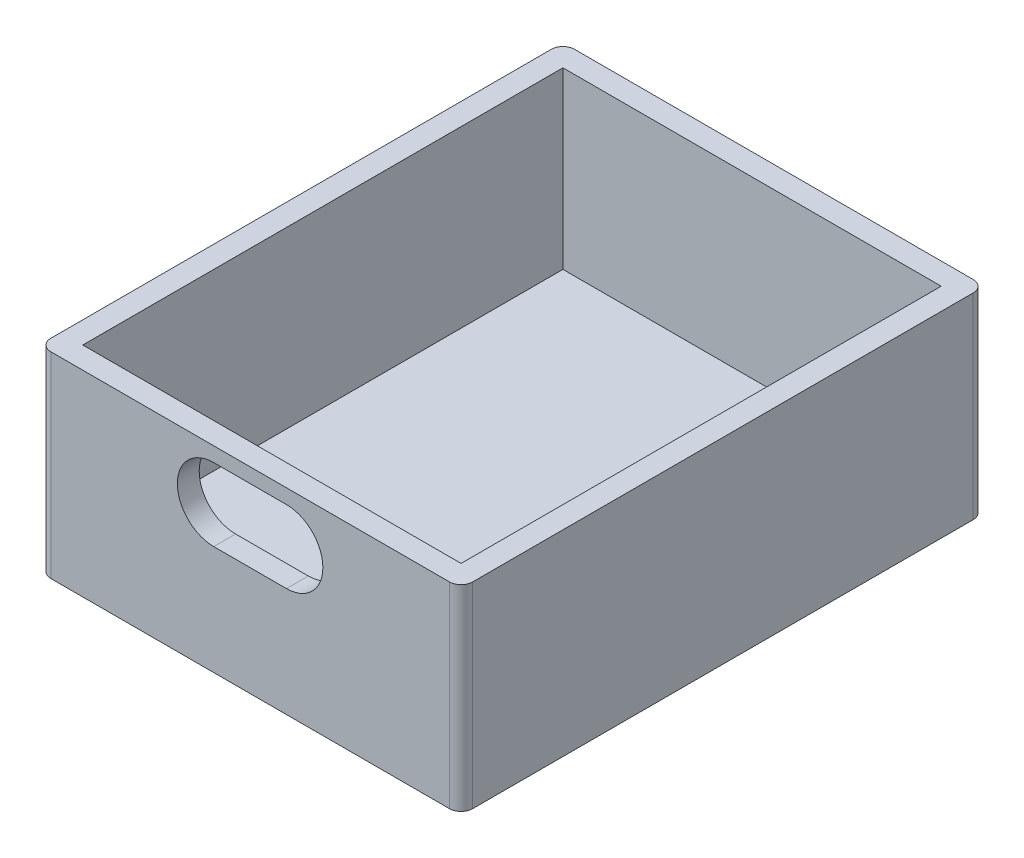
ISO-10303-21;
HEADER;
FILE_DESCRIPTION(('STEP AP214'),'2;1');
FILE_NAME('part.step','',(''),(''),'','','');
FILE_SCHEMA(('AUTOMOTIVE_DESIGN { 1 0 10303 214 1 1 1 1 }'));
ENDSEC;
DATA;
#1=APPLICATION_CONTEXT('core data for automotive mechanical design processes');
#2=APPLICATION_PROTOCOL_DEFINITION('international standard','automotive_design',2000,#1);
#3=PRODUCT_CONTEXT('',#1,'mechanical');
#4=PRODUCT('Part','Part','',(#3));
#5=PRODUCT_RELATED_PRODUCT_CATEGORY('part','',(#4));
#6=PRODUCT_DEFINITION_FORMATION('','',#4);
#7=PRODUCT_DEFINITION_CONTEXT('part definition',#1,'design');
#8=PRODUCT_DEFINITION('design','',#6,#7);
#9=PRODUCT_DEFINITION_SHAPE('','',#8);
#10=(LENGTH_UNIT() NAMED_UNIT(*) SI_UNIT(.MILLI.,.METRE.));
#11=(NAMED_UNIT(*) PLANE_ANGLE_UNIT() SI_UNIT($,.RADIAN.));
#12=(NAMED_UNIT(*) SI_UNIT($,.STERADIAN.) SOLID_ANGLE_UNIT());
#13=UNCERTAINTY_MEASURE_WITH_UNIT(LENGTH_MEASURE(1.E-05),#10,'distance_accuracy_value','');
#14=(GEOMETRIC_REPRESENTATION_CONTEXT(3) GLOBAL_UNCERTAINTY_ASSIGNED_CONTEXT((#13)) GLOBAL_UNIT_ASSIGNED_CONTEXT((#10,
#11,#12)) REPRESENTATION_CONTEXT('',''));
#15=CARTESIAN_POINT('',(0.,0.,0.));
#16=DIRECTION('',(0.,0.,1.));
#17=DIRECTION('',(1.,0.,0.));
#18=AXIS2_PLACEMENT_3D('',#15,#16,#17);
#19=CARTESIAN_POINT('',(0.,-13.5,36.));
#20=DIRECTION('',(0.,1.,0.));
#21=DIRECTION('',(0.,0.,1.));
#22=AXIS2_PLACEMENT_3D('',#19,#20,#21);
#23=PLANE('',#22);
#24=DIRECTION('',(-1.,0.,0.));
#25=VECTOR('',#24,1.);
#26=CARTESIAN_POINT('',(27.2201532544553,-13.5,13.));
#27=LINE('',#26,#25);
#28=CARTESIAN_POINT('',(8.,-13.5,13.));
#29=VERTEX_POINT('',#28);
#30=CARTESIAN_POINT('',(4.,-13.5,13.));
#31=VERTEX_POINT('',#30);
#32=EDGE_CURVE('E752',#29,#31,#27,.T.);
#33=ORIENTED_EDGE('',*,*,#32,.F.);
#34=DIRECTION('',(0.,0.,1.));
#35=VECTOR('',#34,1.);
#36=CARTESIAN_POINT('',(8.,-13.5,10.));
#37=LINE('',#36,#35);
#38=CARTESIAN_POINT('',(8.,-13.5,10.));
#39=VERTEX_POINT('',#38);
#40=EDGE_CURVE('E780',#39,#29,#37,.T.);
#41=ORIENTED_EDGE('',*,*,#40,.F.);
#42=DIRECTION('',(1.,0.,0.));
#43=VECTOR('',#42,1.);
#44=CARTESIAN_POINT('',(8.,-13.5,10.));
#45=LINE('',#44,#43);
#46=CARTESIAN_POINT('',(4.,-13.5,10.));
#47=VERTEX_POINT('',#46);
#48=EDGE_CURVE('E785',#47,#39,#45,.T.);
#49=ORIENTED_EDGE('',*,*,#48,.F.);
#50=DIRECTION('',(0.,0.,-1.));
#51=VECTOR('',#50,1.);
#52=CARTESIAN_POINT('',(4.,-13.5,10.));
#53=LINE('',#52,#51);
#54=EDGE_CURVE('E792',#31,#47,#53,.T.);
#55=ORIENTED_EDGE('',*,*,#54,.F.);
#56=EDGE_LOOP('',(#33,#41,#49,#55));
#57=FACE_BOUND('',#56,.T.);
#58=DIRECTION('',(1.,0.,0.));
#59=VECTOR('',#58,1.);
#60=CARTESIAN_POINT('',(0.,-13.5,36.));
#61=LINE('',#60,#59);
#62=CARTESIAN_POINT('',(0.800000000000003,-13.5,36.));
#63=VERTEX_POINT('',#62);
#64=CARTESIAN_POINT('',(28.2,-13.5,36.));
#65=VERTEX_POINT('',#64);
#66=EDGE_CURVE('E342',#63,#65,#61,.T.);
#67=ORIENTED_EDGE('',*,*,#66,.F.);
#68=CARTESIAN_POINT('',(0.800000000000003,-13.5,35.2));
#69=DIRECTION('',(0.,1.,0.));
#70=DIRECTION('',(0.,0.,1.));
#71=AXIS2_PLACEMENT_3D('',#68,#69,#70);
#72=CIRCLE('',#71,0.8);
#73=CARTESIAN_POINT('',(0.,-13.5,35.2));
#74=VERTEX_POINT('',#73);
#75=EDGE_CURVE('E377',#63,#74,#72,.F.);
#76=ORIENTED_EDGE('',*,*,#75,.T.);
#77=DIRECTION('',(0.,0.,-1.));
#78=VECTOR('',#77,1.);
#79=CARTESIAN_POINT('',(0.,-13.5,36.));
#80=LINE('',#79,#78);
#81=CARTESIAN_POINT('',(0.,-13.5,0.800000000000002));
#82=VERTEX_POINT('',#81);
#83=EDGE_CURVE('E362',#74,#82,#80,.T.);
#84=ORIENTED_EDGE('',*,*,#83,.T.);
#85=CARTESIAN_POINT('',(0.800000000000003,-13.5,0.800000000000002));
#86=DIRECTION('',(0.,1.,0.));
#87=DIRECTION('',(0.,0.,1.));
#88=AXIS2_PLACEMENT_3D('',#85,#86,#87);
#89=CIRCLE('',#88,0.8);
#90=CARTESIAN_POINT('',(0.800000000000003,-13.5,0.));
#91=VERTEX_POINT('',#90);
#92=EDGE_CURVE('E375',#82,#91,#89,.F.);
#93=ORIENTED_EDGE('',*,*,#92,.T.);
#94=DIRECTION('',(1.,0.,0.));
#95=VECTOR('',#94,1.);
#96=CARTESIAN_POINT('',(0.,-13.5,0.));
#97=LINE('',#96,#95);
#98=CARTESIAN_POINT('',(28.2,-13.5,0.));
#99=VERTEX_POINT('',#98);
#100=EDGE_CURVE('E335',#91,#99,#97,.T.);
#101=ORIENTED_EDGE('',*,*,#100,.T.);
#102=CARTESIAN_POINT('',(28.2,-13.5,0.800000000000002));
#103=DIRECTION('',(0.,1.,0.));
#104=DIRECTION('',(0.,0.,1.));
#105=AXIS2_PLACEMENT_3D('',#102,#103,#104);
#106=CIRCLE('',#105,0.8);
#107=CARTESIAN_POINT('',(29.,-13.5,0.800000000000002));
#108=VERTEX_POINT('',#107);
#109=EDGE_CURVE('E373',#99,#108,#106,.F.);
#110=ORIENTED_EDGE('',*,*,#109,.T.);
#111=DIRECTION('',(0.,0.,-1.));
#112=VECTOR('',#111,1.);
#113=CARTESIAN_POINT('',(29.,-13.5,36.));
#114=LINE('',#113,#112);
#115=CARTESIAN_POINT('',(29.,-13.5,35.2));
#116=VERTEX_POINT('',#115);
#117=EDGE_CURVE('E359',#116,#108,#114,.T.);
#118=ORIENTED_EDGE('',*,*,#117,.F.);
#119=CARTESIAN_POINT('',(28.2,-13.5,35.2));
#120=DIRECTION('',(0.,1.,0.));
#121=DIRECTION('',(0.,0.,1.));
#122=AXIS2_PLACEMENT_3D('',#119,#120,#121);
#123=CIRCLE('',#122,0.8);
#124=EDGE_CURVE('E371',#116,#65,#123,.F.);
#125=ORIENTED_EDGE('',*,*,#124,.T.);
#126=EDGE_LOOP('',(#67,#76,#84,#93,#101,#110,#118,#125));
#127=FACE_BOUND('',#126,.T.);
#128=DIRECTION('',(0.,0.,-1.));
#129=VECTOR('',#128,1.);
#130=CARTESIAN_POINT('',(18.,-13.5,10.));
#131=LINE('',#130,#129);
#132=CARTESIAN_POINT('',(18.,-13.5,13.));
#133=VERTEX_POINT('',#132);
#134=CARTESIAN_POINT('',(18.,-13.5,10.));
#135=VERTEX_POINT('',#134);
#136=EDGE_CURVE('E264',#133,#135,#131,.T.);
#137=ORIENTED_EDGE('',*,*,#136,.F.);
#138=CARTESIAN_POINT('',(22.,-13.5,13.));
#139=VERTEX_POINT('',#138);
#140=EDGE_CURVE('E766',#139,#133,#27,.T.);
#141=ORIENTED_EDGE('',*,*,#140,.F.);
#142=DIRECTION('',(0.,0.,1.));
#143=VECTOR('',#142,1.);
#144=CARTESIAN_POINT('',(22.,-13.5,10.));
#145=LINE('',#144,#143);
#146=CARTESIAN_POINT('',(22.,-13.5,10.));
#147=VERTEX_POINT('',#146);
#148=EDGE_CURVE('E244',#147,#139,#145,.T.);
#149=ORIENTED_EDGE('',*,*,#148,.F.);
#150=DIRECTION('',(1.,0.,0.));
#151=VECTOR('',#150,1.);
#152=CARTESIAN_POINT('',(22.,-13.5,10.));
#153=LINE('',#152,#151);
#154=EDGE_CURVE('E255',#135,#147,#153,.T.);
#155=ORIENTED_EDGE('',*,*,#154,.F.);
#156=EDGE_LOOP('',(#137,#141,#149,#155));
#157=FACE_BOUND('',#156,.T.);
#158=ADVANCED_FACE('F35',(#57,#127,#157),#23,.F.);
#159=CARTESIAN_POINT('',(0.,0.,36.));
#160=DIRECTION('',(1.,0.,0.));
#161=DIRECTION('',(0.,1.,0.));
#162=AXIS2_PLACEMENT_3D('',#159,#160,#161);
#163=PLANE('',#162);
#164=ORIENTED_EDGE('',*,*,#83,.F.);
#165=DIRECTION('',(0.,-1.,0.));
#166=VECTOR('',#165,1.);
#167=CARTESIAN_POINT('',(0.,0.,35.2));
#168=LINE('',#167,#166);
#169=CARTESIAN_POINT('',(0.,0.,35.2));
#170=VERTEX_POINT('',#169);
#171=EDGE_CURVE('E382',#74,#170,#168,.F.);
#172=ORIENTED_EDGE('',*,*,#171,.T.);
#173=DIRECTION('',(0.,0.,-1.));
#174=VECTOR('',#173,1.);
#175=CARTESIAN_POINT('',(0.,0.,36.));
#176=LINE('',#175,#174);
#177=CARTESIAN_POINT('',(0.,0.,0.800000000000002));
#178=VERTEX_POINT('',#177);
#179=EDGE_CURVE('E349',#170,#178,#176,.T.);
#180=ORIENTED_EDGE('',*,*,#179,.T.);
#181=DIRECTION('',(0.,-1.,0.));
#182=VECTOR('',#181,1.);
#183=CARTESIAN_POINT('',(0.,0.,0.800000000000002));
#184=LINE('',#183,#182);
#185=EDGE_CURVE('E379',#178,#82,#184,.T.);
#186=ORIENTED_EDGE('',*,*,#185,.T.);
#187=EDGE_LOOP('',(#164,#172,#180,#186));
#188=FACE_BOUND('',#187,.T.);
#189=ADVANCED_FACE('F421',(#188),#163,.F.);
#190=CARTESIAN_POINT('',(29.,0.,36.));
#191=DIRECTION('',(-1.,0.,0.));
#192=DIRECTION('',(0.,-1.,0.));
#193=AXIS2_PLACEMENT_3D('',#190,#191,#192);
#194=PLANE('',#193);
#195=ORIENTED_EDGE('',*,*,#117,.T.);
#196=DIRECTION('',(0.,1.,0.));
#197=VECTOR('',#196,1.);
#198=CARTESIAN_POINT('',(29.,0.,0.800000000000002));
#199=LINE('',#198,#197);
#200=CARTESIAN_POINT('',(29.,0.,0.800000000000002));
#201=VERTEX_POINT('',#200);
#202=EDGE_CURVE('E11',#108,#201,#199,.T.);
#203=ORIENTED_EDGE('',*,*,#202,.T.);
#204=DIRECTION('',(0.,0.,-1.));
#205=VECTOR('',#204,1.);
#206=CARTESIAN_POINT('',(29.,0.,36.));
#207=LINE('',#206,#205);
#208=CARTESIAN_POINT('',(29.,0.,35.2));
#209=VERTEX_POINT('',#208);
#210=EDGE_CURVE('E356',#209,#201,#207,.T.);
#211=ORIENTED_EDGE('',*,*,#210,.F.);
#212=DIRECTION('',(0.,1.,0.));
#213=VECTOR('',#212,1.);
#214=CARTESIAN_POINT('',(29.,-13.5,35.2));
#215=LINE('',#214,#213);
#216=EDGE_CURVE('E43',#209,#116,#215,.F.);
#217=ORIENTED_EDGE('',*,*,#216,.T.);
#218=EDGE_LOOP('',(#195,#203,#211,#217));
#219=FACE_BOUND('',#218,.T.);
#220=ADVANCED_FACE('F399',(#219),#194,.F.);
#221=CARTESIAN_POINT('',(0.,0.,36.));
#222=DIRECTION('',(0.,-1.,0.));
#223=DIRECTION('',(0.,0.,-1.));
#224=AXIS2_PLACEMENT_3D('',#221,#222,#223);
#225=PLANE('',#224);
#226=DIRECTION('',(1.,0.,0.));
#227=VECTOR('',#226,1.);
#228=CARTESIAN_POINT('',(1.5,0.,34.5));
#229=LINE('',#228,#227);
#230=CARTESIAN_POINT('',(1.5,0.,34.5));
#231=VERTEX_POINT('',#230);
#232=CARTESIAN_POINT('',(27.5,0.,34.5));
#233=VERTEX_POINT('',#232);
#234=EDGE_CURVE('E325',#231,#233,#229,.T.);
#235=ORIENTED_EDGE('',*,*,#234,.F.);
#236=DIRECTION('',(0.,0.,1.));
#237=VECTOR('',#236,1.);
#238=CARTESIAN_POINT('',(1.5,0.,1.5));
#239=LINE('',#238,#237);
#240=CARTESIAN_POINT('',(1.5,0.,1.5));
#241=VERTEX_POINT('',#240);
#242=EDGE_CURVE('E309',#241,#231,#239,.T.);
#243=ORIENTED_EDGE('',*,*,#242,.F.);
#244=DIRECTION('',(-1.,0.,0.));
#245=VECTOR('',#244,1.);
#246=CARTESIAN_POINT('',(1.5,0.,1.5));
#247=LINE('',#246,#245);
#248=CARTESIAN_POINT('',(27.5,0.,1.5));
#249=VERTEX_POINT('',#248);
#250=EDGE_CURVE('E314',#249,#241,#247,.T.);
#251=ORIENTED_EDGE('',*,*,#250,.F.);
#252=DIRECTION('',(0.,0.,-1.));
#253=VECTOR('',#252,1.);
#254=CARTESIAN_POINT('',(27.5,0.,1.5));
#255=LINE('',#254,#253);
#256=EDGE_CURVE('E328',#233,#249,#255,.T.);
#257=ORIENTED_EDGE('',*,*,#256,.F.);
#258=EDGE_LOOP('',(#235,#243,#251,#257));
#259=FACE_BOUND('',#258,.T.);
#260=ORIENTED_EDGE('',*,*,#179,.F.);
#261=CARTESIAN_POINT('',(0.8,0.,35.2));
#262=DIRECTION('',(0.,-1.,0.));
#263=DIRECTION('',(0.,0.,-1.));
#264=AXIS2_PLACEMENT_3D('',#261,#262,#263);
#265=CIRCLE('',#264,0.8);
#266=CARTESIAN_POINT('',(0.8,0.,36.));
#267=VERTEX_POINT('',#266);
#268=EDGE_CURVE('E390',#170,#267,#265,.F.);
#269=ORIENTED_EDGE('',*,*,#268,.T.);
#270=DIRECTION('',(-1.,0.,0.));
#271=VECTOR('',#270,1.);
#272=CARTESIAN_POINT('',(0.,0.,36.));
#273=LINE('',#272,#271);
#274=CARTESIAN_POINT('',(28.2,0.,36.));
#275=VERTEX_POINT('',#274);
#276=EDGE_CURVE('E345',#275,#267,#273,.T.);
#277=ORIENTED_EDGE('',*,*,#276,.F.);
#278=CARTESIAN_POINT('',(28.2,0.,35.2));
#279=DIRECTION('',(0.,-1.,0.));
#280=DIRECTION('',(0.,0.,-1.));
#281=AXIS2_PLACEMENT_3D('',#278,#279,#280);
#282=CIRCLE('',#281,0.8);
#283=EDGE_CURVE('E384',#275,#209,#282,.F.);
#284=ORIENTED_EDGE('',*,*,#283,.T.);
#285=ORIENTED_EDGE('',*,*,#210,.T.);
#286=CARTESIAN_POINT('',(28.2,0.,0.800000000000002));
#287=DIRECTION('',(0.,-1.,0.));
#288=DIRECTION('',(0.,0.,-1.));
#289=AXIS2_PLACEMENT_3D('',#286,#287,#288);
#290=CIRCLE('',#289,0.8);
#291=CARTESIAN_POINT('',(28.2,0.,0.));
#292=VERTEX_POINT('',#291);
#293=EDGE_CURVE('E386',#201,#292,#290,.F.);
#294=ORIENTED_EDGE('',*,*,#293,.T.);
#295=DIRECTION('',(-1.,0.,0.));
#296=VECTOR('',#295,1.);
#297=CARTESIAN_POINT('',(0.,0.,0.));
#298=LINE('',#297,#296);
#299=CARTESIAN_POINT('',(0.8,0.,0.));
#300=VERTEX_POINT('',#299);
#301=EDGE_CURVE('E346',#292,#300,#298,.T.);
#302=ORIENTED_EDGE('',*,*,#301,.T.);
#303=CARTESIAN_POINT('',(0.8,0.,0.800000000000002));
#304=DIRECTION('',(0.,-1.,0.));
#305=DIRECTION('',(0.,0.,-1.));
#306=AXIS2_PLACEMENT_3D('',#303,#304,#305);
#307=CIRCLE('',#306,0.8);
#308=EDGE_CURVE('E388',#300,#178,#307,.F.);
#309=ORIENTED_EDGE('',*,*,#308,.T.);
#310=EDGE_LOOP('',(#260,#269,#277,#284,#285,#294,#302,#309));
#311=FACE_BOUND('',#310,.T.);
#312=ADVANCED_FACE('F414',(#259,#311),#225,.F.);
#313=CARTESIAN_POINT('',(0.,0.,36.));
#314=DIRECTION('',(0.,0.,1.));
#315=DIRECTION('',(1.,0.,0.));
#316=AXIS2_PLACEMENT_3D('',#313,#314,#315);
#317=PLANE('',#316);
#318=DIRECTION('',(1.,0.,0.));
#319=VECTOR('',#318,1.);
#320=CARTESIAN_POINT('',(12.,-6.,36.));
#321=LINE('',#320,#319);
#322=CARTESIAN_POINT('',(12.,-6.,36.));
#323=VERTEX_POINT('',#322);
#324=CARTESIAN_POINT('',(17.,-6.,36.));
#325=VERTEX_POINT('',#324);
#326=EDGE_CURVE('E279',#323,#325,#321,.T.);
#327=ORIENTED_EDGE('',*,*,#326,.F.);
#328=CARTESIAN_POINT('',(12.,-3.5,36.));
#329=DIRECTION('',(0.,0.,-1.));
#330=DIRECTION('',(-1.,0.,0.));
#331=AXIS2_PLACEMENT_3D('',#328,#329,#330);
#332=CIRCLE('',#331,2.5);
#333=CARTESIAN_POINT('',(12.,-1.,36.));
#334=VERTEX_POINT('',#333);
#335=EDGE_CURVE('E297',#323,#334,#332,.T.);
#336=ORIENTED_EDGE('',*,*,#335,.T.);
#337=DIRECTION('',(1.,0.,0.));
#338=VECTOR('',#337,1.);
#339=CARTESIAN_POINT('',(12.,-1.,36.));
#340=LINE('',#339,#338);
#341=CARTESIAN_POINT('',(17.,-1.,36.));
#342=VERTEX_POINT('',#341);
#343=EDGE_CURVE('E294',#334,#342,#340,.T.);
#344=ORIENTED_EDGE('',*,*,#343,.T.);
#345=CARTESIAN_POINT('',(17.,-3.5,36.));
#346=DIRECTION('',(0.,0.,1.));
#347=DIRECTION('',(1.,0.,0.));
#348=AXIS2_PLACEMENT_3D('',#345,#346,#347);
#349=CIRCLE('',#348,2.5);
#350=EDGE_CURVE('E291',#325,#342,#349,.T.);
#351=ORIENTED_EDGE('',*,*,#350,.F.);
#352=EDGE_LOOP('',(#327,#336,#344,#351));
#353=FACE_BOUND('',#352,.T.);
#354=ORIENTED_EDGE('',*,*,#276,.T.);
#355=DIRECTION('',(0.,-1.,0.));
#356=VECTOR('',#355,1.);
#357=CARTESIAN_POINT('',(0.800000000000003,-13.5,36.));
#358=LINE('',#357,#356);
#359=EDGE_CURVE('E368',#267,#63,#358,.T.);
#360=ORIENTED_EDGE('',*,*,#359,.T.);
#361=ORIENTED_EDGE('',*,*,#66,.T.);
#362=DIRECTION('',(0.,1.,0.));
#363=VECTOR('',#362,1.);
#364=CARTESIAN_POINT('',(28.2,0.,36.));
#365=LINE('',#364,#363);
#366=EDGE_CURVE('E365',#65,#275,#365,.T.);
#367=ORIENTED_EDGE('',*,*,#366,.T.);
#368=EDGE_LOOP('',(#354,#360,#361,#367));
#369=FACE_BOUND('',#368,.T.);
#370=ADVANCED_FACE('F410',(#353,#369),#317,.T.);
#371=CARTESIAN_POINT('',(0.,0.,0.));
#372=DIRECTION('',(0.,0.,1.));
#373=DIRECTION('',(1.,0.,0.));
#374=AXIS2_PLACEMENT_3D('',#371,#372,#373);
#375=PLANE('',#374);
#376=ORIENTED_EDGE('',*,*,#100,.F.);
#377=DIRECTION('',(0.,-1.,0.));
#378=VECTOR('',#377,1.);
#379=CARTESIAN_POINT('',(0.8,0.,0.));
#380=LINE('',#379,#378);
#381=EDGE_CURVE('E394',#91,#300,#380,.F.);
#382=ORIENTED_EDGE('',*,*,#381,.T.);
#383=ORIENTED_EDGE('',*,*,#301,.F.);
#384=DIRECTION('',(0.,1.,0.));
#385=VECTOR('',#384,1.);
#386=CARTESIAN_POINT('',(28.2,0.,0.));
#387=LINE('',#386,#385);
#388=EDGE_CURVE('E392',#292,#99,#387,.F.);
#389=ORIENTED_EDGE('',*,*,#388,.T.);
#390=EDGE_LOOP('',(#376,#382,#383,#389));
#391=FACE_BOUND('',#390,.T.);
#392=ADVANCED_FACE('F429',(#391),#375,.F.);
#393=CARTESIAN_POINT('',(1.5,-12.,1.5));
#394=DIRECTION('',(-1.,0.,0.));
#395=DIRECTION('',(0.,0.,1.));
#396=AXIS2_PLACEMENT_3D('',#393,#394,#395);
#397=PLANE('',#396);
#398=ORIENTED_EDGE('',*,*,#242,.T.);
#399=DIRECTION('',(0.,1.,0.));
#400=VECTOR('',#399,1.);
#401=CARTESIAN_POINT('',(1.5,-12.,34.5));
#402=LINE('',#401,#400);
#403=CARTESIAN_POINT('',(1.5,-12.,34.5));
#404=VERTEX_POINT('',#403);
#405=EDGE_CURVE('E323',#404,#231,#402,.T.);
#406=ORIENTED_EDGE('',*,*,#405,.F.);
#407=DIRECTION('',(0.,0.,1.));
#408=VECTOR('',#407,1.);
#409=CARTESIAN_POINT('',(1.5,-12.,1.5));
#410=LINE('',#409,#408);
#411=CARTESIAN_POINT('',(1.5,-12.,1.5));
#412=VERTEX_POINT('',#411);
#413=EDGE_CURVE('E310',#412,#404,#410,.T.);
#414=ORIENTED_EDGE('',*,*,#413,.F.);
#415=DIRECTION('',(0.,1.,0.));
#416=VECTOR('',#415,1.);
#417=CARTESIAN_POINT('',(1.5,-12.,1.5));
#418=LINE('',#417,#416);
#419=EDGE_CURVE('E333',#412,#241,#418,.T.);
#420=ORIENTED_EDGE('',*,*,#419,.T.);
#421=EDGE_LOOP('',(#398,#406,#414,#420));
#422=FACE_BOUND('',#421,.T.);
#423=ADVANCED_FACE('F481',(#422),#397,.F.);
#424=CARTESIAN_POINT('',(1.5,-12.,1.5));
#425=DIRECTION('',(0.,0.,-1.));
#426=DIRECTION('',(-1.,0.,0.));
#427=AXIS2_PLACEMENT_3D('',#424,#425,#426);
#428=PLANE('',#427);
#429=ORIENTED_EDGE('',*,*,#250,.T.);
#430=ORIENTED_EDGE('',*,*,#419,.F.);
#431=DIRECTION('',(-1.,0.,0.));
#432=VECTOR('',#431,1.);
#433=CARTESIAN_POINT('',(1.5,-12.,1.5));
#434=LINE('',#433,#432);
#435=CARTESIAN_POINT('',(27.5,-12.,1.5));
#436=VERTEX_POINT('',#435);
#437=EDGE_CURVE('E320',#436,#412,#434,.T.);
#438=ORIENTED_EDGE('',*,*,#437,.F.);
#439=DIRECTION('',(0.,1.,0.));
#440=VECTOR('',#439,1.);
#441=CARTESIAN_POINT('',(27.5,-12.,1.5));
#442=LINE('',#441,#440);
#443=EDGE_CURVE('E336',#436,#249,#442,.T.);
#444=ORIENTED_EDGE('',*,*,#443,.T.);
#445=EDGE_LOOP('',(#429,#430,#438,#444));
#446=FACE_BOUND('',#445,.T.);
#447=ADVANCED_FACE('F477',(#446),#428,.F.);
#448=CARTESIAN_POINT('',(27.5,-12.,1.5));
#449=DIRECTION('',(1.,0.,0.));
#450=DIRECTION('',(0.,0.,-1.));
#451=AXIS2_PLACEMENT_3D('',#448,#449,#450);
#452=PLANE('',#451);
#453=ORIENTED_EDGE('',*,*,#256,.T.);
#454=ORIENTED_EDGE('',*,*,#443,.F.);
#455=DIRECTION('',(0.,0.,-1.));
#456=VECTOR('',#455,1.);
#457=CARTESIAN_POINT('',(27.5,-12.,1.5));
#458=LINE('',#457,#456);
#459=CARTESIAN_POINT('',(27.5,-12.,34.5));
#460=VERTEX_POINT('',#459);
#461=EDGE_CURVE('E317',#460,#436,#458,.T.);
#462=ORIENTED_EDGE('',*,*,#461,.F.);
#463=DIRECTION('',(0.,1.,0.));
#464=VECTOR('',#463,1.);
#465=CARTESIAN_POINT('',(27.5,-12.,34.5));
#466=LINE('',#465,#464);
#467=EDGE_CURVE('E338',#460,#233,#466,.T.);
#468=ORIENTED_EDGE('',*,*,#467,.T.);
#469=EDGE_LOOP('',(#453,#454,#462,#468));
#470=FACE_BOUND('',#469,.T.);
#471=ADVANCED_FACE('F480',(#470),#452,.F.);
#472=CARTESIAN_POINT('',(1.5,-12.,34.5));
#473=DIRECTION('',(0.,0.,1.));
#474=DIRECTION('',(1.,0.,0.));
#475=AXIS2_PLACEMENT_3D('',#472,#473,#474);
#476=PLANE('',#475);
#477=CARTESIAN_POINT('',(12.,-3.5,34.5));
#478=DIRECTION('',(0.,0.,1.));
#479=DIRECTION('',(1.,0.,0.));
#480=AXIS2_PLACEMENT_3D('',#477,#478,#479);
#481=CIRCLE('',#480,2.5);
#482=CARTESIAN_POINT('',(12.,-1.,34.5));
#483=VERTEX_POINT('',#482);
#484=CARTESIAN_POINT('',(12.,-6.,34.5));
#485=VERTEX_POINT('',#484);
#486=EDGE_CURVE('E283',#483,#485,#481,.T.);
#487=ORIENTED_EDGE('',*,*,#486,.T.);
#488=DIRECTION('',(-1.,0.,0.));
#489=VECTOR('',#488,1.);
#490=CARTESIAN_POINT('',(12.,-6.,34.5));
#491=LINE('',#490,#489);
#492=CARTESIAN_POINT('',(17.,-6.,34.5));
#493=VERTEX_POINT('',#492);
#494=EDGE_CURVE('E287',#493,#485,#491,.T.);
#495=ORIENTED_EDGE('',*,*,#494,.F.);
#496=CARTESIAN_POINT('',(17.,-3.5,34.5));
#497=DIRECTION('',(0.,0.,1.));
#498=DIRECTION('',(1.,0.,0.));
#499=AXIS2_PLACEMENT_3D('',#496,#497,#498);
#500=CIRCLE('',#499,2.5);
#501=CARTESIAN_POINT('',(17.,-1.,34.5));
#502=VERTEX_POINT('',#501);
#503=EDGE_CURVE('E289',#502,#493,#500,.F.);
#504=ORIENTED_EDGE('',*,*,#503,.F.);
#505=DIRECTION('',(-1.,0.,0.));
#506=VECTOR('',#505,1.);
#507=CARTESIAN_POINT('',(12.,-1.,34.5));
#508=LINE('',#507,#506);
#509=EDGE_CURVE('E280',#502,#483,#508,.T.);
#510=ORIENTED_EDGE('',*,*,#509,.T.);
#511=EDGE_LOOP('',(#487,#495,#504,#510));
#512=FACE_BOUND('',#511,.T.);
#513=ORIENTED_EDGE('',*,*,#234,.T.);
#514=ORIENTED_EDGE('',*,*,#467,.F.);
#515=DIRECTION('',(1.,0.,0.));
#516=VECTOR('',#515,1.);
#517=CARTESIAN_POINT('',(1.5,-12.,34.5));
#518=LINE('',#517,#516);
#519=EDGE_CURVE('E313',#404,#460,#518,.T.);
#520=ORIENTED_EDGE('',*,*,#519,.F.);
#521=ORIENTED_EDGE('',*,*,#405,.T.);
#522=EDGE_LOOP('',(#513,#514,#520,#521));
#523=FACE_BOUND('',#522,.T.);
#524=ADVANCED_FACE('F475',(#512,#523),#476,.F.);
#525=CARTESIAN_POINT('',(0.,-12.,0.));
#526=DIRECTION('',(0.,1.,0.));
#527=DIRECTION('',(0.,0.,1.));
#528=AXIS2_PLACEMENT_3D('',#525,#526,#527);
#529=PLANE('',#528);
#530=ORIENTED_EDGE('',*,*,#413,.T.);
#531=ORIENTED_EDGE('',*,*,#519,.T.);
#532=ORIENTED_EDGE('',*,*,#461,.T.);
#533=ORIENTED_EDGE('',*,*,#437,.T.);
#534=EDGE_LOOP('',(#530,#531,#532,#533));
#535=FACE_BOUND('',#534,.T.);
#536=ADVANCED_FACE('F471',(#535),#529,.T.);
#537=CARTESIAN_POINT('',(12.,-6.,23.319660112501));
#538=DIRECTION('',(0.,-1.,0.));
#539=DIRECTION('',(0.,0.,-1.));
#540=AXIS2_PLACEMENT_3D('',#537,#538,#539);
#541=PLANE('',#540);
#542=ORIENTED_EDGE('',*,*,#494,.T.);
#543=DIRECTION('',(0.,0.,1.));
#544=VECTOR('',#543,1.);
#545=CARTESIAN_POINT('',(12.,-6.,23.319660112501));
#546=LINE('',#545,#544);
#547=EDGE_CURVE('E284',#485,#323,#546,.T.);
#548=ORIENTED_EDGE('',*,*,#547,.T.);
#549=ORIENTED_EDGE('',*,*,#326,.T.);
#550=DIRECTION('',(0.,0.,1.));
#551=VECTOR('',#550,1.);
#552=CARTESIAN_POINT('',(17.,-6.,23.319660112501));
#553=LINE('',#552,#551);
#554=EDGE_CURVE('E300',#493,#325,#553,.T.);
#555=ORIENTED_EDGE('',*,*,#554,.F.);
#556=EDGE_LOOP('',(#542,#548,#549,#555));
#557=FACE_BOUND('',#556,.T.);
#558=ADVANCED_FACE('F468',(#557),#541,.F.);
#559=CARTESIAN_POINT('',(12.,-3.5,23.319660112501));
#560=DIRECTION('',(0.,0.,1.));
#561=DIRECTION('',(1.,0.,0.));
#562=AXIS2_PLACEMENT_3D('',#559,#560,#561);
#563=CYLINDRICAL_SURFACE('',#562,2.5);
#564=DIRECTION('',(0.,0.,1.));
#565=VECTOR('',#564,1.);
#566=CARTESIAN_POINT('',(12.,-1.,23.319660112501));
#567=LINE('',#566,#565);
#568=EDGE_CURVE('E302',#483,#334,#567,.T.);
#569=ORIENTED_EDGE('',*,*,#568,.T.);
#570=ORIENTED_EDGE('',*,*,#335,.F.);
#571=ORIENTED_EDGE('',*,*,#547,.F.);
#572=ORIENTED_EDGE('',*,*,#486,.F.);
#573=EDGE_LOOP('',(#569,#570,#571,#572));
#574=FACE_BOUND('',#573,.T.);
#575=ADVANCED_FACE('F463',(#574),#563,.F.);
#576=CARTESIAN_POINT('',(12.,-1.,23.319660112501));
#577=DIRECTION('',(0.,-1.,0.));
#578=DIRECTION('',(0.,0.,-1.));
#579=AXIS2_PLACEMENT_3D('',#576,#577,#578);
#580=PLANE('',#579);
#581=DIRECTION('',(0.,0.,1.));
#582=VECTOR('',#581,1.);
#583=CARTESIAN_POINT('',(17.,-1.,23.319660112501));
#584=LINE('',#583,#582);
#585=EDGE_CURVE('E304',#502,#342,#584,.T.);
#586=ORIENTED_EDGE('',*,*,#585,.T.);
#587=ORIENTED_EDGE('',*,*,#343,.F.);
#588=ORIENTED_EDGE('',*,*,#568,.F.);
#589=ORIENTED_EDGE('',*,*,#509,.F.);
#590=EDGE_LOOP('',(#586,#587,#588,#589));
#591=FACE_BOUND('',#590,.T.);
#592=ADVANCED_FACE('F457',(#591),#580,.T.);
#593=CARTESIAN_POINT('',(17.,-3.5,23.319660112501));
#594=DIRECTION('',(0.,0.,1.));
#595=DIRECTION('',(1.,0.,0.));
#596=AXIS2_PLACEMENT_3D('',#593,#594,#595);
#597=CYLINDRICAL_SURFACE('',#596,2.5);
#598=ORIENTED_EDGE('',*,*,#503,.T.);
#599=ORIENTED_EDGE('',*,*,#554,.T.);
#600=ORIENTED_EDGE('',*,*,#350,.T.);
#601=ORIENTED_EDGE('',*,*,#585,.F.);
#602=EDGE_LOOP('',(#598,#599,#600,#601));
#603=FACE_BOUND('',#602,.T.);
#604=ADVANCED_FACE('F453',(#603),#597,.F.);
#605=CARTESIAN_POINT('',(0.8,0.,35.2));
#606=DIRECTION('',(0.,1.,0.));
#607=DIRECTION('',(-1.,0.,0.));
#608=AXIS2_PLACEMENT_3D('',#605,#606,#607);
#609=CYLINDRICAL_SURFACE('',#608,0.8);
#610=ORIENTED_EDGE('',*,*,#268,.F.);
#611=ORIENTED_EDGE('',*,*,#171,.F.);
#612=ORIENTED_EDGE('',*,*,#75,.F.);
#613=ORIENTED_EDGE('',*,*,#359,.F.);
#614=EDGE_LOOP('',(#610,#611,#612,#613));
#615=FACE_BOUND('',#614,.T.);
#616=ADVANCED_FACE('F418',(#615),#609,.T.);
#617=CARTESIAN_POINT('',(0.8,0.,0.800000000000002));
#618=DIRECTION('',(0.,-1.,0.));
#619=DIRECTION('',(1.,0.,0.));
#620=AXIS2_PLACEMENT_3D('',#617,#618,#619);
#621=CYLINDRICAL_SURFACE('',#620,0.8);
#622=ORIENTED_EDGE('',*,*,#308,.F.);
#623=ORIENTED_EDGE('',*,*,#381,.F.);
#624=ORIENTED_EDGE('',*,*,#92,.F.);
#625=ORIENTED_EDGE('',*,*,#185,.F.);
#626=EDGE_LOOP('',(#622,#623,#624,#625));
#627=FACE_BOUND('',#626,.T.);
#628=ADVANCED_FACE('F425',(#627),#621,.T.);
#629=CARTESIAN_POINT('',(28.2,0.,0.800000000000002));
#630=DIRECTION('',(0.,1.,0.));
#631=DIRECTION('',(-1.,0.,0.));
#632=AXIS2_PLACEMENT_3D('',#629,#630,#631);
#633=CYLINDRICAL_SURFACE('',#632,0.8);
#634=ORIENTED_EDGE('',*,*,#109,.F.);
#635=ORIENTED_EDGE('',*,*,#388,.F.);
#636=ORIENTED_EDGE('',*,*,#293,.F.);
#637=ORIENTED_EDGE('',*,*,#202,.F.);
#638=EDGE_LOOP('',(#634,#635,#636,#637));
#639=FACE_BOUND('',#638,.T.);
#640=ADVANCED_FACE('F433',(#639),#633,.T.);
#641=CARTESIAN_POINT('',(28.2,0.,35.2));
#642=DIRECTION('',(0.,-1.,0.));
#643=DIRECTION('',(1.,0.,0.));
#644=AXIS2_PLACEMENT_3D('',#641,#642,#643);
#645=CYLINDRICAL_SURFACE('',#644,0.8);
#646=ORIENTED_EDGE('',*,*,#124,.F.);
#647=ORIENTED_EDGE('',*,*,#216,.F.);
#648=ORIENTED_EDGE('',*,*,#283,.F.);
#649=ORIENTED_EDGE('',*,*,#366,.F.);
#650=EDGE_LOOP('',(#646,#647,#648,#649));
#651=FACE_BOUND('',#650,.T.);
#652=ADVANCED_FACE('F37',(#651),#645,.T.);
#653=CARTESIAN_POINT('',(22.,-17.,10.));
#654=DIRECTION('',(-1.,0.,0.));
#655=DIRECTION('',(0.,0.,1.));
#656=AXIS2_PLACEMENT_3D('',#653,#654,#655);
#657=PLANE('',#656);
#658=ORIENTED_EDGE('',*,*,#148,.T.);
#659=DIRECTION('',(0.,1.,0.));
#660=VECTOR('',#659,1.);
#661=CARTESIAN_POINT('',(22.,-13.5,13.));
#662=LINE('',#661,#660);
#663=CARTESIAN_POINT('',(22.,-15.,13.));
#664=VERTEX_POINT('',#663);
#665=EDGE_CURVE('E756',#664,#139,#662,.T.);
#666=ORIENTED_EDGE('',*,*,#665,.F.);
#667=DIRECTION('',(0.,0.,-1.));
#668=VECTOR('',#667,1.);
#669=CARTESIAN_POINT('',(22.,-15.,13.));
#670=LINE('',#669,#668);
#671=CARTESIAN_POINT('',(22.,-15.,18.));
#672=VERTEX_POINT('',#671);
#673=EDGE_CURVE('E748',#672,#664,#670,.T.);
#674=ORIENTED_EDGE('',*,*,#673,.F.);
#675=DIRECTION('',(0.,1.,0.));
#676=VECTOR('',#675,1.);
#677=CARTESIAN_POINT('',(22.,-17.,18.));
#678=LINE('',#677,#676);
#679=CARTESIAN_POINT('',(22.,-17.,18.));
#680=VERTEX_POINT('',#679);
#681=EDGE_CURVE('E276',#680,#672,#678,.T.);
#682=ORIENTED_EDGE('',*,*,#681,.F.);
#683=DIRECTION('',(0.,0.,1.));
#684=VECTOR('',#683,1.);
#685=CARTESIAN_POINT('',(22.,-17.,10.));
#686=LINE('',#685,#684);
#687=CARTESIAN_POINT('',(22.,-17.,10.));
#688=VERTEX_POINT('',#687);
#689=EDGE_CURVE('E251',#688,#680,#686,.T.);
#690=ORIENTED_EDGE('',*,*,#689,.F.);
#691=DIRECTION('',(0.,1.,0.));
#692=VECTOR('',#691,1.);
#693=CARTESIAN_POINT('',(22.,-17.,10.));
#694=LINE('',#693,#692);
#695=EDGE_CURVE('E261',#688,#147,#694,.T.);
#696=ORIENTED_EDGE('',*,*,#695,.T.);
#697=EDGE_LOOP('',(#658,#666,#674,#682,#690,#696));
#698=FACE_BOUND('',#697,.T.);
#699=ADVANCED_FACE('F439',(#698),#657,.F.);
#700=CARTESIAN_POINT('',(22.,-17.,18.));
#701=DIRECTION('',(0.,0.,-1.));
#702=DIRECTION('',(-1.,0.,0.));
#703=AXIS2_PLACEMENT_3D('',#700,#701,#702);
#704=PLANE('',#703);
#705=ORIENTED_EDGE('',*,*,#681,.T.);
#706=DIRECTION('',(-1.,0.,0.));
#707=VECTOR('',#706,1.);
#708=CARTESIAN_POINT('',(27.2201532544553,-15.,18.));
#709=LINE('',#708,#707);
#710=CARTESIAN_POINT('',(18.,-15.,18.));
#711=VERTEX_POINT('',#710);
#712=EDGE_CURVE('E237',#672,#711,#709,.T.);
#713=ORIENTED_EDGE('',*,*,#712,.T.);
#714=DIRECTION('',(0.,1.,0.));
#715=VECTOR('',#714,1.);
#716=CARTESIAN_POINT('',(18.,-17.,18.));
#717=LINE('',#716,#715);
#718=CARTESIAN_POINT('',(18.,-17.,18.));
#719=VERTEX_POINT('',#718);
#720=EDGE_CURVE('E273',#719,#711,#717,.T.);
#721=ORIENTED_EDGE('',*,*,#720,.F.);
#722=DIRECTION('',(-1.,0.,0.));
#723=VECTOR('',#722,1.);
#724=CARTESIAN_POINT('',(22.,-17.,18.));
#725=LINE('',#724,#723);
#726=EDGE_CURVE('E254',#680,#719,#725,.T.);
#727=ORIENTED_EDGE('',*,*,#726,.F.);
#728=EDGE_LOOP('',(#705,#713,#721,#727));
#729=FACE_BOUND('',#728,.T.);
#730=ADVANCED_FACE('F672',(#729),#704,.F.);
#731=CARTESIAN_POINT('',(18.,-17.,10.));
#732=DIRECTION('',(1.,0.,0.));
#733=DIRECTION('',(0.,0.,-1.));
#734=AXIS2_PLACEMENT_3D('',#731,#732,#733);
#735=PLANE('',#734);
#736=DIRECTION('',(0.,0.,-1.));
#737=VECTOR('',#736,1.);
#738=CARTESIAN_POINT('',(18.,-15.,10.));
#739=LINE('',#738,#737);
#740=CARTESIAN_POINT('',(18.,-15.,13.));
#741=VERTEX_POINT('',#740);
#742=EDGE_CURVE('E750',#711,#741,#739,.T.);
#743=ORIENTED_EDGE('',*,*,#742,.T.);
#744=DIRECTION('',(0.,1.,0.));
#745=VECTOR('',#744,1.);
#746=CARTESIAN_POINT('',(18.,-17.,13.));
#747=LINE('',#746,#745);
#748=EDGE_CURVE('E778',#741,#133,#747,.T.);
#749=ORIENTED_EDGE('',*,*,#748,.T.);
#750=ORIENTED_EDGE('',*,*,#136,.T.);
#751=DIRECTION('',(0.,1.,0.));
#752=VECTOR('',#751,1.);
#753=CARTESIAN_POINT('',(18.,-17.,10.));
#754=LINE('',#753,#752);
#755=CARTESIAN_POINT('',(18.,-17.,10.));
#756=VERTEX_POINT('',#755);
#757=EDGE_CURVE('E270',#756,#135,#754,.T.);
#758=ORIENTED_EDGE('',*,*,#757,.F.);
#759=DIRECTION('',(0.,0.,-1.));
#760=VECTOR('',#759,1.);
#761=CARTESIAN_POINT('',(18.,-17.,10.));
#762=LINE('',#761,#760);
#763=EDGE_CURVE('E257',#719,#756,#762,.T.);
#764=ORIENTED_EDGE('',*,*,#763,.F.);
#765=ORIENTED_EDGE('',*,*,#720,.T.);
#766=EDGE_LOOP('',(#743,#749,#750,#758,#764,#765));
#767=FACE_BOUND('',#766,.T.);
#768=ADVANCED_FACE('F621',(#767),#735,.F.);
#769=CARTESIAN_POINT('',(22.,-17.,10.));
#770=DIRECTION('',(0.,0.,1.));
#771=DIRECTION('',(1.,0.,0.));
#772=AXIS2_PLACEMENT_3D('',#769,#770,#771);
#773=PLANE('',#772);
#774=ORIENTED_EDGE('',*,*,#154,.T.);
#775=ORIENTED_EDGE('',*,*,#695,.F.);
#776=DIRECTION('',(1.,0.,0.));
#777=VECTOR('',#776,1.);
#778=CARTESIAN_POINT('',(22.,-17.,10.));
#779=LINE('',#778,#777);
#780=EDGE_CURVE('E259',#756,#688,#779,.T.);
#781=ORIENTED_EDGE('',*,*,#780,.F.);
#782=ORIENTED_EDGE('',*,*,#757,.T.);
#783=EDGE_LOOP('',(#774,#775,#781,#782));
#784=FACE_BOUND('',#783,.T.);
#785=ADVANCED_FACE('F615',(#784),#773,.F.);
#786=CARTESIAN_POINT('',(0.,-17.,0.));
#787=DIRECTION('',(0.,-1.,0.));
#788=DIRECTION('',(0.,0.,-1.));
#789=AXIS2_PLACEMENT_3D('',#786,#787,#788);
#790=PLANE('',#789);
#791=ORIENTED_EDGE('',*,*,#689,.T.);
#792=ORIENTED_EDGE('',*,*,#726,.T.);
#793=ORIENTED_EDGE('',*,*,#763,.T.);
#794=ORIENTED_EDGE('',*,*,#780,.T.);
#795=EDGE_LOOP('',(#791,#792,#793,#794));
#796=FACE_BOUND('',#795,.T.);
#797=ADVANCED_FACE('F620',(#796),#790,.T.);
#798=CARTESIAN_POINT('',(8.,-17.,10.));
#799=DIRECTION('',(-1.,0.,0.));
#800=DIRECTION('',(0.,0.,1.));
#801=AXIS2_PLACEMENT_3D('',#798,#799,#800);
#802=PLANE('',#801);
#803=ORIENTED_EDGE('',*,*,#40,.T.);
#804=DIRECTION('',(0.,-1.,0.));
#805=VECTOR('',#804,1.);
#806=CARTESIAN_POINT('',(8.,-17.,13.));
#807=LINE('',#806,#805);
#808=CARTESIAN_POINT('',(8.,-15.,13.));
#809=VERTEX_POINT('',#808);
#810=EDGE_CURVE('E775',#29,#809,#807,.T.);
#811=ORIENTED_EDGE('',*,*,#810,.T.);
#812=DIRECTION('',(0.,0.,1.));
#813=VECTOR('',#812,1.);
#814=CARTESIAN_POINT('',(8.,-15.,10.));
#815=LINE('',#814,#813);
#816=CARTESIAN_POINT('',(8.,-15.,18.));
#817=VERTEX_POINT('',#816);
#818=EDGE_CURVE('E757',#809,#817,#815,.T.);
#819=ORIENTED_EDGE('',*,*,#818,.T.);
#820=DIRECTION('',(0.,1.,0.));
#821=VECTOR('',#820,1.);
#822=CARTESIAN_POINT('',(8.,-17.,18.));
#823=LINE('',#822,#821);
#824=CARTESIAN_POINT('',(8.,-17.,18.));
#825=VERTEX_POINT('',#824);
#826=EDGE_CURVE('E236',#825,#817,#823,.T.);
#827=ORIENTED_EDGE('',*,*,#826,.F.);
#828=DIRECTION('',(0.,0.,1.));
#829=VECTOR('',#828,1.);
#830=CARTESIAN_POINT('',(8.,-17.,10.));
#831=LINE('',#830,#829);
#832=CARTESIAN_POINT('',(8.,-17.,10.));
#833=VERTEX_POINT('',#832);
#834=EDGE_CURVE('E781',#833,#825,#831,.T.);
#835=ORIENTED_EDGE('',*,*,#834,.F.);
#836=DIRECTION('',(0.,1.,0.));
#837=VECTOR('',#836,1.);
#838=CARTESIAN_POINT('',(8.,-17.,10.));
#839=LINE('',#838,#837);
#840=EDGE_CURVE('E247',#833,#39,#839,.T.);
#841=ORIENTED_EDGE('',*,*,#840,.T.);
#842=EDGE_LOOP('',(#803,#811,#819,#827,#835,#841));
#843=FACE_BOUND('',#842,.T.);
#844=ADVANCED_FACE('F633',(#843),#802,.F.);
#845=CARTESIAN_POINT('',(8.,-17.,18.));
#846=DIRECTION('',(0.,0.,-1.));
#847=DIRECTION('',(-1.,0.,0.));
#848=AXIS2_PLACEMENT_3D('',#845,#846,#847);
#849=PLANE('',#848);
#850=ORIENTED_EDGE('',*,*,#826,.T.);
#851=CARTESIAN_POINT('',(4.,-15.,18.));
#852=VERTEX_POINT('',#851);
#853=EDGE_CURVE('E223',#817,#852,#709,.T.);
#854=ORIENTED_EDGE('',*,*,#853,.T.);
#855=DIRECTION('',(0.,1.,0.));
#856=VECTOR('',#855,1.);
#857=CARTESIAN_POINT('',(4.,-17.,18.));
#858=LINE('',#857,#856);
#859=CARTESIAN_POINT('',(4.,-17.,18.));
#860=VERTEX_POINT('',#859);
#861=EDGE_CURVE('E233',#860,#852,#858,.T.);
#862=ORIENTED_EDGE('',*,*,#861,.F.);
#863=DIRECTION('',(-1.,0.,0.));
#864=VECTOR('',#863,1.);
#865=CARTESIAN_POINT('',(8.,-17.,18.));
#866=LINE('',#865,#864);
#867=EDGE_CURVE('E784',#825,#860,#866,.T.);
#868=ORIENTED_EDGE('',*,*,#867,.F.);
#869=EDGE_LOOP('',(#850,#854,#862,#868));
#870=FACE_BOUND('',#869,.T.);
#871=ADVANCED_FACE('F232',(#870),#849,.F.);
#872=CARTESIAN_POINT('',(4.,-17.,10.));
#873=DIRECTION('',(1.,0.,0.));
#874=DIRECTION('',(0.,0.,-1.));
#875=AXIS2_PLACEMENT_3D('',#872,#873,#874);
#876=PLANE('',#875);
#877=DIRECTION('',(0.,0.,1.));
#878=VECTOR('',#877,1.);
#879=CARTESIAN_POINT('',(4.,-15.,13.));
#880=LINE('',#879,#878);
#881=CARTESIAN_POINT('',(4.,-15.,13.));
#882=VERTEX_POINT('',#881);
#883=EDGE_CURVE('E220',#882,#852,#880,.T.);
#884=ORIENTED_EDGE('',*,*,#883,.F.);
#885=DIRECTION('',(0.,-1.,0.));
#886=VECTOR('',#885,1.);
#887=CARTESIAN_POINT('',(4.,-13.5,13.));
#888=LINE('',#887,#886);
#889=EDGE_CURVE('E58',#31,#882,#888,.T.);
#890=ORIENTED_EDGE('',*,*,#889,.F.);
#891=ORIENTED_EDGE('',*,*,#54,.T.);
#892=DIRECTION('',(0.,1.,0.));
#893=VECTOR('',#892,1.);
#894=CARTESIAN_POINT('',(4.,-17.,10.));
#895=LINE('',#894,#893);
#896=CARTESIAN_POINT('',(4.,-17.,10.));
#897=VERTEX_POINT('',#896);
#898=EDGE_CURVE('E242',#897,#47,#895,.T.);
#899=ORIENTED_EDGE('',*,*,#898,.F.);
#900=DIRECTION('',(0.,0.,-1.));
#901=VECTOR('',#900,1.);
#902=CARTESIAN_POINT('',(4.,-17.,10.));
#903=LINE('',#902,#901);
#904=EDGE_CURVE('E241',#860,#897,#903,.T.);
#905=ORIENTED_EDGE('',*,*,#904,.F.);
#906=ORIENTED_EDGE('',*,*,#861,.T.);
#907=EDGE_LOOP('',(#884,#890,#891,#899,#905,#906));
#908=FACE_BOUND('',#907,.T.);
#909=ADVANCED_FACE('F239',(#908),#876,.F.);
#910=CARTESIAN_POINT('',(8.,-17.,10.));
#911=DIRECTION('',(0.,0.,1.));
#912=DIRECTION('',(1.,0.,0.));
#913=AXIS2_PLACEMENT_3D('',#910,#911,#912);
#914=PLANE('',#913);
#915=ORIENTED_EDGE('',*,*,#48,.T.);
#916=ORIENTED_EDGE('',*,*,#840,.F.);
#917=DIRECTION('',(1.,0.,0.));
#918=VECTOR('',#917,1.);
#919=CARTESIAN_POINT('',(8.,-17.,10.));
#920=LINE('',#919,#918);
#921=EDGE_CURVE('E788',#897,#833,#920,.T.);
#922=ORIENTED_EDGE('',*,*,#921,.F.);
#923=ORIENTED_EDGE('',*,*,#898,.T.);
#924=EDGE_LOOP('',(#915,#916,#922,#923));
#925=FACE_BOUND('',#924,.T.);
#926=ADVANCED_FACE('F641',(#925),#914,.F.);
#927=CARTESIAN_POINT('',(0.,-17.,0.));
#928=DIRECTION('',(0.,-1.,0.));
#929=DIRECTION('',(0.,0.,-1.));
#930=AXIS2_PLACEMENT_3D('',#927,#928,#929);
#931=PLANE('',#930);
#932=ORIENTED_EDGE('',*,*,#834,.T.);
#933=ORIENTED_EDGE('',*,*,#867,.T.);
#934=ORIENTED_EDGE('',*,*,#904,.T.);
#935=ORIENTED_EDGE('',*,*,#921,.T.);
#936=EDGE_LOOP('',(#932,#933,#934,#935));
#937=FACE_BOUND('',#936,.T.);
#938=ADVANCED_FACE('F646',(#937),#931,.T.);
#939=CARTESIAN_POINT('',(27.2201532544553,-15.,13.));
#940=DIRECTION('',(0.,-1.,0.));
#941=DIRECTION('',(0.,0.,-1.));
#942=AXIS2_PLACEMENT_3D('',#939,#940,#941);
#943=PLANE('',#942);
#944=DIRECTION('',(-1.,0.,0.));
#945=VECTOR('',#944,1.);
#946=CARTESIAN_POINT('',(27.2201532544553,-15.,13.));
#947=LINE('',#946,#945);
#948=EDGE_CURVE('E225',#809,#882,#947,.T.);
#949=ORIENTED_EDGE('',*,*,#948,.T.);
#950=ORIENTED_EDGE('',*,*,#883,.T.);
#951=ORIENTED_EDGE('',*,*,#853,.F.);
#952=ORIENTED_EDGE('',*,*,#818,.F.);
#953=EDGE_LOOP('',(#949,#950,#951,#952));
#954=FACE_BOUND('',#953,.T.);
#955=ADVANCED_FACE('F222',(#954),#943,.F.);
#956=CARTESIAN_POINT('',(27.2201532544553,-13.5,13.));
#957=DIRECTION('',(0.,0.,-1.));
#958=DIRECTION('',(-1.,0.,0.));
#959=AXIS2_PLACEMENT_3D('',#956,#957,#958);
#960=PLANE('',#959);
#961=ORIENTED_EDGE('',*,*,#32,.T.);
#962=ORIENTED_EDGE('',*,*,#889,.T.);
#963=ORIENTED_EDGE('',*,*,#948,.F.);
#964=ORIENTED_EDGE('',*,*,#810,.F.);
#965=EDGE_LOOP('',(#961,#962,#963,#964));
#966=FACE_BOUND('',#965,.T.);
#967=ADVANCED_FACE('F717',(#966),#960,.F.);
#968=EDGE_CURVE('E50',#664,#741,#947,.T.);
#969=ORIENTED_EDGE('',*,*,#968,.F.);
#970=ORIENTED_EDGE('',*,*,#665,.T.);
#971=ORIENTED_EDGE('',*,*,#140,.T.);
#972=ORIENTED_EDGE('',*,*,#748,.F.);
#973=EDGE_LOOP('',(#969,#970,#971,#972));
#974=FACE_BOUND('',#973,.T.);
#975=ADVANCED_FACE('F727',(#974),#960,.F.);
#976=ORIENTED_EDGE('',*,*,#712,.F.);
#977=ORIENTED_EDGE('',*,*,#673,.T.);
#978=ORIENTED_EDGE('',*,*,#968,.T.);
#979=ORIENTED_EDGE('',*,*,#742,.F.);
#980=EDGE_LOOP('',(#976,#977,#978,#979));
#981=FACE_BOUND('',#980,.T.);
#982=ADVANCED_FACE('F719',(#981),#943,.F.);
#983=CLOSED_SHELL('',(#158,#189,#220,#312,#370,#392,#423,#447,#471,#524,#536,#558,#575,#592,
#604,#616,#628,#640,#652,#699,#730,#768,#785,#797,#844,#871,#909,#926,#938,#955,#967,#975,#982));
#984=MANIFOLD_SOLID_BREP('B2',#983);
#985=ADVANCED_BREP_SHAPE_REPRESENTATION('',(#18,#984),#14);
#986=SHAPE_DEFINITION_REPRESENTATION(#9,#985);
ENDSEC;
END-ISO-10303-21;
